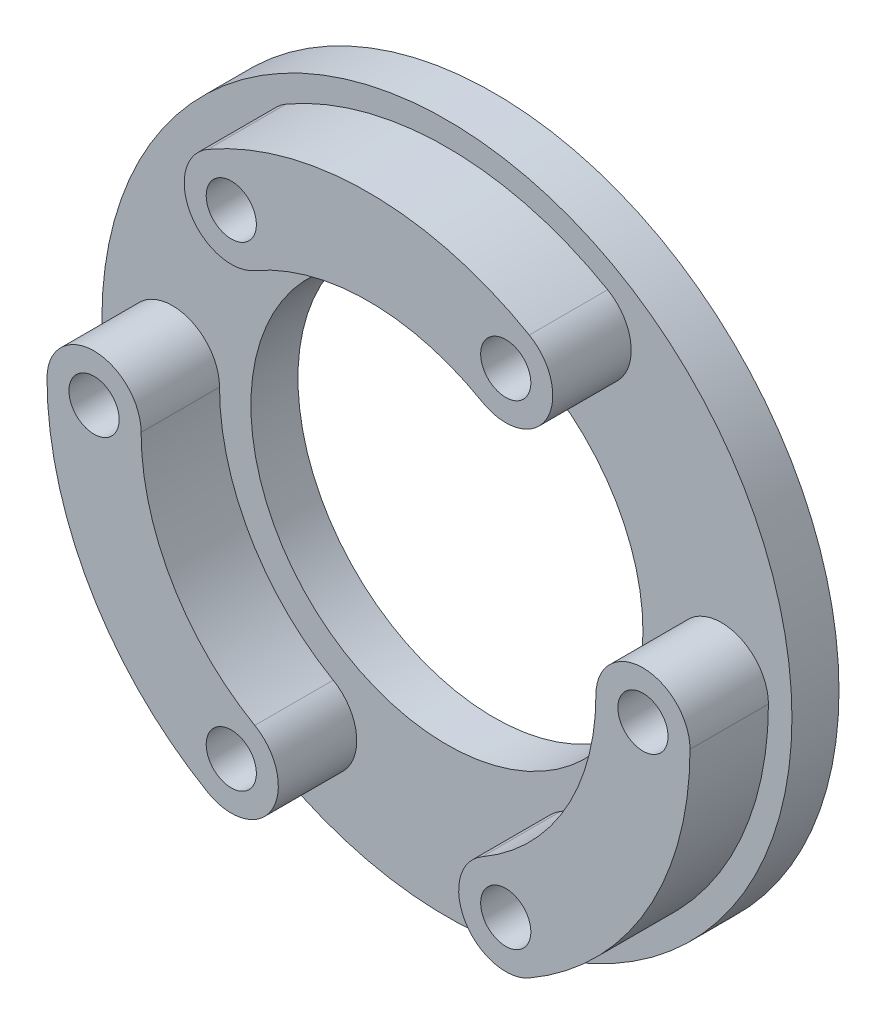
ISO-10303-21;
HEADER;
FILE_DESCRIPTION(('STEP AP214'),'2;1');
FILE_NAME('part.step','',(''),(''),'','','');
FILE_SCHEMA(('AUTOMOTIVE_DESIGN { 1 0 10303 214 1 1 1 1 }'));
ENDSEC;
DATA;
#1=APPLICATION_CONTEXT('core data for automotive mechanical design processes');
#2=APPLICATION_PROTOCOL_DEFINITION('international standard','automotive_design',2000,#1);
#3=PRODUCT_CONTEXT('',#1,'mechanical');
#4=PRODUCT('Part','Part','',(#3));
#5=PRODUCT_RELATED_PRODUCT_CATEGORY('part','',(#4));
#6=PRODUCT_DEFINITION_FORMATION('','',#4);
#7=PRODUCT_DEFINITION_CONTEXT('part definition',#1,'design');
#8=PRODUCT_DEFINITION('design','',#6,#7);
#9=PRODUCT_DEFINITION_SHAPE('','',#8);
#10=(LENGTH_UNIT() NAMED_UNIT(*) SI_UNIT(.MILLI.,.METRE.));
#11=(NAMED_UNIT(*) PLANE_ANGLE_UNIT() SI_UNIT($,.RADIAN.));
#12=(NAMED_UNIT(*) SI_UNIT($,.STERADIAN.) SOLID_ANGLE_UNIT());
#13=UNCERTAINTY_MEASURE_WITH_UNIT(LENGTH_MEASURE(1.E-05),#10,'distance_accuracy_value','');
#14=(GEOMETRIC_REPRESENTATION_CONTEXT(3) GLOBAL_UNCERTAINTY_ASSIGNED_CONTEXT((#13)) GLOBAL_UNIT_ASSIGNED_CONTEXT((#10,
#11,#12)) REPRESENTATION_CONTEXT('',''));
#15=CARTESIAN_POINT('',(0.,0.,0.));
#16=DIRECTION('',(0.,0.,1.));
#17=DIRECTION('',(1.,0.,0.));
#18=AXIS2_PLACEMENT_3D('',#15,#16,#17);
#19=CARTESIAN_POINT('',(0.,0.,3.));
#20=DIRECTION('',(0.,0.,1.));
#21=DIRECTION('',(1.,0.,0.));
#22=AXIS2_PLACEMENT_3D('',#19,#20,#21);
#23=PLANE('',#22);
#24=CARTESIAN_POINT('',(17.5,0.,3.));
#25=DIRECTION('',(0.,0.,1.));
#26=DIRECTION('',(1.,0.,0.));
#27=AXIS2_PLACEMENT_3D('',#24,#25,#26);
#28=CIRCLE('',#27,3.);
#29=CARTESIAN_POINT('',(14.5,0.,3.));
#30=VERTEX_POINT('',#29);
#31=CARTESIAN_POINT('',(20.5,0.,3.));
#32=VERTEX_POINT('',#31);
#33=EDGE_CURVE('E165',#30,#32,#28,.F.);
#34=ORIENTED_EDGE('',*,*,#33,.T.);
#35=CARTESIAN_POINT('',(0.,0.,3.));
#36=DIRECTION('',(0.,0.,1.));
#37=DIRECTION('',(1.,0.,0.));
#38=AXIS2_PLACEMENT_3D('',#35,#36,#37);
#39=CIRCLE('',#38,20.5);
#40=CARTESIAN_POINT('',(10.25,-17.753520777581,3.));
#41=VERTEX_POINT('',#40);
#42=EDGE_CURVE('E155',#32,#41,#39,.F.);
#43=ORIENTED_EDGE('',*,*,#42,.T.);
#44=CARTESIAN_POINT('',(8.74999999999998,-15.1554445662277,3.));
#45=DIRECTION('',(0.,0.,1.));
#46=DIRECTION('',(1.,0.,0.));
#47=AXIS2_PLACEMENT_3D('',#44,#45,#46);
#48=CIRCLE('',#47,3.);
#49=CARTESIAN_POINT('',(7.24999999999998,-12.5573683548744,3.));
#50=VERTEX_POINT('',#49);
#51=EDGE_CURVE('E156',#41,#50,#48,.F.);
#52=ORIENTED_EDGE('',*,*,#51,.T.);
#53=CARTESIAN_POINT('',(0.,0.,3.));
#54=DIRECTION('',(0.,0.,1.));
#55=DIRECTION('',(1.,0.,0.));
#56=AXIS2_PLACEMENT_3D('',#53,#54,#55);
#57=CIRCLE('',#56,14.5);
#58=EDGE_CURVE('E159',#30,#50,#57,.F.);
#59=ORIENTED_EDGE('',*,*,#58,.F.);
#60=EDGE_LOOP('',(#34,#43,#52,#59));
#61=FACE_BOUND('',#60,.T.);
#62=CARTESIAN_POINT('',(-8.75000000000001,15.1554445662277,3.));
#63=DIRECTION('',(0.,0.,1.));
#64=DIRECTION('',(1.,0.,0.));
#65=AXIS2_PLACEMENT_3D('',#62,#63,#64);
#66=CIRCLE('',#65,3.);
#67=CARTESIAN_POINT('',(-7.25000000000001,12.5573683548744,3.));
#68=VERTEX_POINT('',#67);
#69=CARTESIAN_POINT('',(-10.25,17.753520777581,3.));
#70=VERTEX_POINT('',#69);
#71=EDGE_CURVE('E193',#68,#70,#66,.F.);
#72=ORIENTED_EDGE('',*,*,#71,.T.);
#73=CARTESIAN_POINT('',(0.,0.,3.));
#74=DIRECTION('',(0.,0.,1.));
#75=DIRECTION('',(1.,0.,0.));
#76=AXIS2_PLACEMENT_3D('',#73,#74,#75);
#77=CIRCLE('',#76,20.5);
#78=CARTESIAN_POINT('',(10.25,17.753520777581,3.));
#79=VERTEX_POINT('',#78);
#80=EDGE_CURVE('E196',#70,#79,#77,.F.);
#81=ORIENTED_EDGE('',*,*,#80,.T.);
#82=CARTESIAN_POINT('',(8.75000000000003,15.1554445662277,3.));
#83=DIRECTION('',(0.,0.,1.));
#84=DIRECTION('',(1.,0.,0.));
#85=AXIS2_PLACEMENT_3D('',#82,#83,#84);
#86=CIRCLE('',#85,3.);
#87=CARTESIAN_POINT('',(7.25000000000002,12.5573683548743,3.));
#88=VERTEX_POINT('',#87);
#89=EDGE_CURVE('E188',#79,#88,#86,.F.);
#90=ORIENTED_EDGE('',*,*,#89,.T.);
#91=CARTESIAN_POINT('',(0.,0.,3.));
#92=DIRECTION('',(0.,0.,1.));
#93=DIRECTION('',(1.,0.,0.));
#94=AXIS2_PLACEMENT_3D('',#91,#92,#93);
#95=CIRCLE('',#94,14.5);
#96=EDGE_CURVE('E191',#68,#88,#95,.F.);
#97=ORIENTED_EDGE('',*,*,#96,.F.);
#98=EDGE_LOOP('',(#72,#81,#90,#97));
#99=FACE_BOUND('',#98,.T.);
#100=CARTESIAN_POINT('',(-8.75,-15.1554445662277,3.));
#101=DIRECTION('',(0.,0.,1.));
#102=DIRECTION('',(1.,0.,0.));
#103=AXIS2_PLACEMENT_3D('',#100,#101,#102);
#104=CIRCLE('',#103,3.);
#105=CARTESIAN_POINT('',(-7.25,-12.5573683548744,3.));
#106=VERTEX_POINT('',#105);
#107=CARTESIAN_POINT('',(-10.25,-17.753520777581,3.));
#108=VERTEX_POINT('',#107);
#109=EDGE_CURVE('E226',#106,#108,#104,.F.);
#110=ORIENTED_EDGE('',*,*,#109,.T.);
#111=CARTESIAN_POINT('',(0.,0.,3.));
#112=DIRECTION('',(0.,0.,1.));
#113=DIRECTION('',(1.,0.,0.));
#114=AXIS2_PLACEMENT_3D('',#111,#112,#113);
#115=CIRCLE('',#114,20.5);
#116=CARTESIAN_POINT('',(-20.5,0.,3.));
#117=VERTEX_POINT('',#116);
#118=EDGE_CURVE('E229',#108,#117,#115,.F.);
#119=ORIENTED_EDGE('',*,*,#118,.T.);
#120=CARTESIAN_POINT('',(-17.5,0.,3.));
#121=DIRECTION('',(0.,0.,1.));
#122=DIRECTION('',(1.,0.,0.));
#123=AXIS2_PLACEMENT_3D('',#120,#121,#122);
#124=CIRCLE('',#123,3.);
#125=CARTESIAN_POINT('',(-14.5,0.,3.));
#126=VERTEX_POINT('',#125);
#127=EDGE_CURVE('E220',#117,#126,#124,.F.);
#128=ORIENTED_EDGE('',*,*,#127,.T.);
#129=CARTESIAN_POINT('',(0.,0.,3.));
#130=DIRECTION('',(0.,0.,1.));
#131=DIRECTION('',(1.,0.,0.));
#132=AXIS2_PLACEMENT_3D('',#129,#130,#131);
#133=CIRCLE('',#132,14.5);
#134=EDGE_CURVE('E223',#106,#126,#133,.F.);
#135=ORIENTED_EDGE('',*,*,#134,.F.);
#136=EDGE_LOOP('',(#110,#119,#128,#135));
#137=FACE_BOUND('',#136,.T.);
#138=CARTESIAN_POINT('',(0.,0.,3.));
#139=DIRECTION('',(0.,0.,1.));
#140=DIRECTION('',(1.,0.,0.));
#141=AXIS2_PLACEMENT_3D('',#138,#139,#140);
#142=CIRCLE('',#141,22.);
#143=CARTESIAN_POINT('',(22.,0.,3.));
#144=VERTEX_POINT('',#143);
#145=EDGE_CURVE('E12',#144,#144,#142,.T.);
#146=ORIENTED_EDGE('',*,*,#145,.T.);
#147=EDGE_LOOP('',(#146));
#148=FACE_BOUND('',#147,.T.);
#149=CARTESIAN_POINT('',(0.,0.,3.));
#150=DIRECTION('',(0.,0.,1.));
#151=DIRECTION('',(1.,0.,0.));
#152=AXIS2_PLACEMENT_3D('',#149,#150,#151);
#153=CIRCLE('',#152,12.5);
#154=CARTESIAN_POINT('',(12.5,0.,3.));
#155=VERTEX_POINT('',#154);
#156=EDGE_CURVE('E233',#155,#155,#153,.T.);
#157=ORIENTED_EDGE('',*,*,#156,.F.);
#158=EDGE_LOOP('',(#157));
#159=FACE_BOUND('',#158,.T.);
#160=ADVANCED_FACE('F42',(#61,#99,#137,#148,#159),#23,.T.);
#161=CARTESIAN_POINT('',(0.,0.,0.));
#162=DIRECTION('',(0.,0.,1.));
#163=DIRECTION('',(1.,0.,0.));
#164=AXIS2_PLACEMENT_3D('',#161,#162,#163);
#165=PLANE('',#164);
#166=CARTESIAN_POINT('',(8.75000000000003,15.1554445662277,0.));
#167=DIRECTION('',(0.,0.,-1.));
#168=DIRECTION('',(-1.,0.,0.));
#169=AXIS2_PLACEMENT_3D('',#166,#167,#168);
#170=CIRCLE('',#169,1.59999999999999);
#171=CARTESIAN_POINT('',(7.15000000000004,15.1554445662277,0.));
#172=VERTEX_POINT('',#171);
#173=EDGE_CURVE('E487',#172,#172,#170,.T.);
#174=ORIENTED_EDGE('',*,*,#173,.F.);
#175=EDGE_LOOP('',(#174));
#176=FACE_BOUND('',#175,.T.);
#177=CARTESIAN_POINT('',(17.5,0.,0.));
#178=DIRECTION('',(0.,0.,-1.));
#179=DIRECTION('',(-1.,0.,0.));
#180=AXIS2_PLACEMENT_3D('',#177,#178,#179);
#181=CIRCLE('',#180,1.59999999999999);
#182=CARTESIAN_POINT('',(15.9,0.,0.));
#183=VERTEX_POINT('',#182);
#184=EDGE_CURVE('E489',#183,#183,#181,.T.);
#185=ORIENTED_EDGE('',*,*,#184,.F.);
#186=EDGE_LOOP('',(#185));
#187=FACE_BOUND('',#186,.T.);
#188=CARTESIAN_POINT('',(8.74999999999998,-15.1554445662277,0.));
#189=DIRECTION('',(0.,0.,-1.));
#190=DIRECTION('',(-1.,0.,0.));
#191=AXIS2_PLACEMENT_3D('',#188,#189,#190);
#192=CIRCLE('',#191,1.59999999999999);
#193=CARTESIAN_POINT('',(7.14999999999999,-15.1554445662277,0.));
#194=VERTEX_POINT('',#193);
#195=EDGE_CURVE('E497',#194,#194,#192,.T.);
#196=ORIENTED_EDGE('',*,*,#195,.F.);
#197=EDGE_LOOP('',(#196));
#198=FACE_BOUND('',#197,.T.);
#199=CARTESIAN_POINT('',(-8.75,-15.1554445662277,0.));
#200=DIRECTION('',(0.,0.,-1.));
#201=DIRECTION('',(-1.,0.,0.));
#202=AXIS2_PLACEMENT_3D('',#199,#200,#201);
#203=CIRCLE('',#202,1.59999999999999);
#204=CARTESIAN_POINT('',(-10.35,-15.1554445662277,0.));
#205=VERTEX_POINT('',#204);
#206=EDGE_CURVE('E503',#205,#205,#203,.T.);
#207=ORIENTED_EDGE('',*,*,#206,.F.);
#208=EDGE_LOOP('',(#207));
#209=FACE_BOUND('',#208,.T.);
#210=CARTESIAN_POINT('',(-17.5,0.,0.));
#211=DIRECTION('',(0.,0.,-1.));
#212=DIRECTION('',(-1.,0.,0.));
#213=AXIS2_PLACEMENT_3D('',#210,#211,#212);
#214=CIRCLE('',#213,1.59999999999999);
#215=CARTESIAN_POINT('',(-19.1,0.,0.));
#216=VERTEX_POINT('',#215);
#217=EDGE_CURVE('E509',#216,#216,#214,.T.);
#218=ORIENTED_EDGE('',*,*,#217,.F.);
#219=EDGE_LOOP('',(#218));
#220=FACE_BOUND('',#219,.T.);
#221=CARTESIAN_POINT('',(-8.75000000000001,15.1554445662277,0.));
#222=DIRECTION('',(0.,0.,-1.));
#223=DIRECTION('',(-1.,0.,0.));
#224=AXIS2_PLACEMENT_3D('',#221,#222,#223);
#225=CIRCLE('',#224,1.59999999999999);
#226=CARTESIAN_POINT('',(-10.35,15.1554445662277,0.));
#227=VERTEX_POINT('',#226);
#228=EDGE_CURVE('E515',#227,#227,#225,.T.);
#229=ORIENTED_EDGE('',*,*,#228,.F.);
#230=EDGE_LOOP('',(#229));
#231=FACE_BOUND('',#230,.T.);
#232=CARTESIAN_POINT('',(0.,0.,0.));
#233=DIRECTION('',(0.,0.,1.));
#234=DIRECTION('',(1.,0.,0.));
#235=AXIS2_PLACEMENT_3D('',#232,#233,#234);
#236=CIRCLE('',#235,22.);
#237=CARTESIAN_POINT('',(22.,0.,0.));
#238=VERTEX_POINT('',#237);
#239=EDGE_CURVE('E46',#238,#238,#236,.T.);
#240=ORIENTED_EDGE('',*,*,#239,.F.);
#241=EDGE_LOOP('',(#240));
#242=FACE_BOUND('',#241,.T.);
#243=CARTESIAN_POINT('',(0.,0.,0.));
#244=DIRECTION('',(0.,0.,1.));
#245=DIRECTION('',(1.,0.,0.));
#246=AXIS2_PLACEMENT_3D('',#243,#244,#245);
#247=CIRCLE('',#246,12.5);
#248=CARTESIAN_POINT('',(12.5,0.,0.));
#249=VERTEX_POINT('',#248);
#250=EDGE_CURVE('E232',#249,#249,#247,.T.);
#251=ORIENTED_EDGE('',*,*,#250,.T.);
#252=EDGE_LOOP('',(#251));
#253=FACE_BOUND('',#252,.T.);
#254=ADVANCED_FACE('F239',(#176,#187,#198,#209,#220,#231,#242,#253),#165,.F.);
#255=CARTESIAN_POINT('',(0.,0.,3.));
#256=DIRECTION('',(0.,0.,-1.));
#257=DIRECTION('',(-1.,0.,0.));
#258=AXIS2_PLACEMENT_3D('',#255,#256,#257);
#259=CYLINDRICAL_SURFACE('',#258,22.);
#260=ORIENTED_EDGE('',*,*,#145,.F.);
#261=EDGE_LOOP('',(#260));
#262=FACE_BOUND('',#261,.T.);
#263=ORIENTED_EDGE('',*,*,#239,.T.);
#264=EDGE_LOOP('',(#263));
#265=FACE_BOUND('',#264,.T.);
#266=ADVANCED_FACE('F44',(#262,#265),#259,.T.);
#267=CARTESIAN_POINT('',(0.,0.,3.));
#268=DIRECTION('',(0.,0.,-1.));
#269=DIRECTION('',(-1.,0.,0.));
#270=AXIS2_PLACEMENT_3D('',#267,#268,#269);
#271=CYLINDRICAL_SURFACE('',#270,12.5);
#272=ORIENTED_EDGE('',*,*,#156,.T.);
#273=EDGE_LOOP('',(#272));
#274=FACE_BOUND('',#273,.T.);
#275=ORIENTED_EDGE('',*,*,#250,.F.);
#276=EDGE_LOOP('',(#275));
#277=FACE_BOUND('',#276,.T.);
#278=ADVANCED_FACE('F241',(#274,#277),#271,.F.);
#279=CARTESIAN_POINT('',(0.,0.,8.));
#280=DIRECTION('',(0.,0.,-1.));
#281=DIRECTION('',(-1.,0.,0.));
#282=AXIS2_PLACEMENT_3D('',#279,#280,#281);
#283=CYLINDRICAL_SURFACE('',#282,20.5);
#284=ORIENTED_EDGE('',*,*,#118,.F.);
#285=DIRECTION('',(0.,0.,-1.));
#286=VECTOR('',#285,1.);
#287=CARTESIAN_POINT('',(-10.25,-17.753520777581,8.));
#288=LINE('',#287,#286);
#289=CARTESIAN_POINT('',(-10.25,-17.753520777581,8.));
#290=VERTEX_POINT('',#289);
#291=EDGE_CURVE('E217',#290,#108,#288,.T.);
#292=ORIENTED_EDGE('',*,*,#291,.F.);
#293=CARTESIAN_POINT('',(0.,0.,8.));
#294=DIRECTION('',(0.,0.,1.));
#295=DIRECTION('',(1.,0.,0.));
#296=AXIS2_PLACEMENT_3D('',#293,#294,#295);
#297=CIRCLE('',#296,20.5);
#298=CARTESIAN_POINT('',(-20.5,0.,8.));
#299=VERTEX_POINT('',#298);
#300=EDGE_CURVE('E199',#299,#290,#297,.T.);
#301=ORIENTED_EDGE('',*,*,#300,.F.);
#302=DIRECTION('',(0.,0.,-1.));
#303=VECTOR('',#302,1.);
#304=CARTESIAN_POINT('',(-20.5,0.,8.));
#305=LINE('',#304,#303);
#306=EDGE_CURVE('E209',#299,#117,#305,.T.);
#307=ORIENTED_EDGE('',*,*,#306,.T.);
#308=EDGE_LOOP('',(#284,#292,#301,#307));
#309=FACE_BOUND('',#308,.T.);
#310=ADVANCED_FACE('F243',(#309),#283,.T.);
#311=CARTESIAN_POINT('',(-8.75,-15.1554445662277,8.));
#312=DIRECTION('',(0.,0.,-1.));
#313=DIRECTION('',(-1.,0.,0.));
#314=AXIS2_PLACEMENT_3D('',#311,#312,#313);
#315=CYLINDRICAL_SURFACE('',#314,3.);
#316=ORIENTED_EDGE('',*,*,#109,.F.);
#317=DIRECTION('',(0.,0.,-1.));
#318=VECTOR('',#317,1.);
#319=CARTESIAN_POINT('',(-7.25,-12.5573683548744,8.));
#320=LINE('',#319,#318);
#321=CARTESIAN_POINT('',(-7.25,-12.5573683548744,8.));
#322=VERTEX_POINT('',#321);
#323=EDGE_CURVE('E214',#322,#106,#320,.T.);
#324=ORIENTED_EDGE('',*,*,#323,.F.);
#325=CARTESIAN_POINT('',(-8.75,-15.1554445662277,8.));
#326=DIRECTION('',(0.,0.,1.));
#327=DIRECTION('',(1.,0.,0.));
#328=AXIS2_PLACEMENT_3D('',#325,#326,#327);
#329=CIRCLE('',#328,3.);
#330=EDGE_CURVE('E202',#290,#322,#329,.T.);
#331=ORIENTED_EDGE('',*,*,#330,.F.);
#332=ORIENTED_EDGE('',*,*,#291,.T.);
#333=EDGE_LOOP('',(#316,#324,#331,#332));
#334=FACE_BOUND('',#333,.T.);
#335=ADVANCED_FACE('F250',(#334),#315,.T.);
#336=CARTESIAN_POINT('',(0.,0.,8.));
#337=DIRECTION('',(0.,0.,-1.));
#338=DIRECTION('',(-1.,0.,0.));
#339=AXIS2_PLACEMENT_3D('',#336,#337,#338);
#340=CYLINDRICAL_SURFACE('',#339,14.5);
#341=ORIENTED_EDGE('',*,*,#323,.T.);
#342=ORIENTED_EDGE('',*,*,#134,.T.);
#343=DIRECTION('',(0.,0.,-1.));
#344=VECTOR('',#343,1.);
#345=CARTESIAN_POINT('',(-14.5,0.,8.));
#346=LINE('',#345,#344);
#347=CARTESIAN_POINT('',(-14.5,0.,8.));
#348=VERTEX_POINT('',#347);
#349=EDGE_CURVE('E212',#348,#126,#346,.T.);
#350=ORIENTED_EDGE('',*,*,#349,.F.);
#351=CARTESIAN_POINT('',(0.,0.,8.));
#352=DIRECTION('',(0.,0.,1.));
#353=DIRECTION('',(1.,0.,0.));
#354=AXIS2_PLACEMENT_3D('',#351,#352,#353);
#355=CIRCLE('',#354,14.5);
#356=EDGE_CURVE('E204',#348,#322,#355,.T.);
#357=ORIENTED_EDGE('',*,*,#356,.T.);
#358=EDGE_LOOP('',(#341,#342,#350,#357));
#359=FACE_BOUND('',#358,.T.);
#360=ADVANCED_FACE('F278',(#359),#340,.F.);
#361=CARTESIAN_POINT('',(-17.5,0.,8.));
#362=DIRECTION('',(0.,0.,-1.));
#363=DIRECTION('',(-1.,0.,0.));
#364=AXIS2_PLACEMENT_3D('',#361,#362,#363);
#365=CYLINDRICAL_SURFACE('',#364,3.);
#366=ORIENTED_EDGE('',*,*,#127,.F.);
#367=ORIENTED_EDGE('',*,*,#306,.F.);
#368=CARTESIAN_POINT('',(-17.5,0.,8.));
#369=DIRECTION('',(0.,0.,1.));
#370=DIRECTION('',(1.,0.,0.));
#371=AXIS2_PLACEMENT_3D('',#368,#369,#370);
#372=CIRCLE('',#371,3.);
#373=EDGE_CURVE('E207',#348,#299,#372,.T.);
#374=ORIENTED_EDGE('',*,*,#373,.F.);
#375=ORIENTED_EDGE('',*,*,#349,.T.);
#376=EDGE_LOOP('',(#366,#367,#374,#375));
#377=FACE_BOUND('',#376,.T.);
#378=ADVANCED_FACE('F286',(#377),#365,.T.);
#379=CARTESIAN_POINT('',(0.,0.,8.));
#380=DIRECTION('',(0.,0.,1.));
#381=DIRECTION('',(1.,0.,0.));
#382=AXIS2_PLACEMENT_3D('',#379,#380,#381);
#383=PLANE('',#382);
#384=CARTESIAN_POINT('',(-8.75,-15.1554445662277,8.));
#385=DIRECTION('',(0.,0.,-1.));
#386=DIRECTION('',(-1.,0.,0.));
#387=AXIS2_PLACEMENT_3D('',#384,#385,#386);
#388=CIRCLE('',#387,1.6);
#389=CARTESIAN_POINT('',(-10.35,-15.1554445662277,8.));
#390=VERTEX_POINT('',#389);
#391=EDGE_CURVE('E506',#390,#390,#388,.T.);
#392=ORIENTED_EDGE('',*,*,#391,.T.);
#393=EDGE_LOOP('',(#392));
#394=FACE_BOUND('',#393,.T.);
#395=CARTESIAN_POINT('',(-17.5,0.,8.));
#396=DIRECTION('',(0.,0.,-1.));
#397=DIRECTION('',(-1.,0.,0.));
#398=AXIS2_PLACEMENT_3D('',#395,#396,#397);
#399=CIRCLE('',#398,1.6);
#400=CARTESIAN_POINT('',(-19.1,0.,8.));
#401=VERTEX_POINT('',#400);
#402=EDGE_CURVE('E512',#401,#401,#399,.T.);
#403=ORIENTED_EDGE('',*,*,#402,.T.);
#404=EDGE_LOOP('',(#403));
#405=FACE_BOUND('',#404,.T.);
#406=ORIENTED_EDGE('',*,*,#300,.T.);
#407=ORIENTED_EDGE('',*,*,#330,.T.);
#408=ORIENTED_EDGE('',*,*,#356,.F.);
#409=ORIENTED_EDGE('',*,*,#373,.T.);
#410=EDGE_LOOP('',(#406,#407,#408,#409));
#411=FACE_BOUND('',#410,.T.);
#412=ADVANCED_FACE('F282',(#394,#405,#411),#383,.T.);
#413=CARTESIAN_POINT('',(0.,0.,8.));
#414=DIRECTION('',(0.,0.,-1.));
#415=DIRECTION('',(-1.,0.,0.));
#416=AXIS2_PLACEMENT_3D('',#413,#414,#415);
#417=CYLINDRICAL_SURFACE('',#416,20.5);
#418=ORIENTED_EDGE('',*,*,#80,.F.);
#419=DIRECTION('',(0.,0.,-1.));
#420=VECTOR('',#419,1.);
#421=CARTESIAN_POINT('',(-10.25,17.753520777581,8.));
#422=LINE('',#421,#420);
#423=CARTESIAN_POINT('',(-10.25,17.753520777581,8.));
#424=VERTEX_POINT('',#423);
#425=EDGE_CURVE('E185',#424,#70,#422,.T.);
#426=ORIENTED_EDGE('',*,*,#425,.F.);
#427=CARTESIAN_POINT('',(0.,0.,8.));
#428=DIRECTION('',(0.,0.,1.));
#429=DIRECTION('',(1.,0.,0.));
#430=AXIS2_PLACEMENT_3D('',#427,#428,#429);
#431=CIRCLE('',#430,20.5);
#432=CARTESIAN_POINT('',(10.25,17.753520777581,8.));
#433=VERTEX_POINT('',#432);
#434=EDGE_CURVE('E168',#433,#424,#431,.T.);
#435=ORIENTED_EDGE('',*,*,#434,.F.);
#436=DIRECTION('',(0.,0.,-1.));
#437=VECTOR('',#436,1.);
#438=CARTESIAN_POINT('',(10.25,17.753520777581,8.));
#439=LINE('',#438,#437);
#440=EDGE_CURVE('E178',#433,#79,#439,.T.);
#441=ORIENTED_EDGE('',*,*,#440,.T.);
#442=EDGE_LOOP('',(#418,#426,#435,#441));
#443=FACE_BOUND('',#442,.T.);
#444=ADVANCED_FACE('F293',(#443),#417,.T.);
#445=CARTESIAN_POINT('',(-8.75000000000001,15.1554445662277,8.));
#446=DIRECTION('',(0.,0.,-1.));
#447=DIRECTION('',(-1.,0.,0.));
#448=AXIS2_PLACEMENT_3D('',#445,#446,#447);
#449=CYLINDRICAL_SURFACE('',#448,3.);
#450=ORIENTED_EDGE('',*,*,#71,.F.);
#451=DIRECTION('',(0.,0.,-1.));
#452=VECTOR('',#451,1.);
#453=CARTESIAN_POINT('',(-7.25000000000001,12.5573683548744,8.));
#454=LINE('',#453,#452);
#455=CARTESIAN_POINT('',(-7.25000000000001,12.5573683548744,8.));
#456=VERTEX_POINT('',#455);
#457=EDGE_CURVE('E182',#456,#68,#454,.T.);
#458=ORIENTED_EDGE('',*,*,#457,.F.);
#459=CARTESIAN_POINT('',(-8.75000000000001,15.1554445662277,8.));
#460=DIRECTION('',(0.,0.,1.));
#461=DIRECTION('',(1.,0.,0.));
#462=AXIS2_PLACEMENT_3D('',#459,#460,#461);
#463=CIRCLE('',#462,3.);
#464=EDGE_CURVE('E171',#424,#456,#463,.T.);
#465=ORIENTED_EDGE('',*,*,#464,.F.);
#466=ORIENTED_EDGE('',*,*,#425,.T.);
#467=EDGE_LOOP('',(#450,#458,#465,#466));
#468=FACE_BOUND('',#467,.T.);
#469=ADVANCED_FACE('F322',(#468),#449,.T.);
#470=CARTESIAN_POINT('',(0.,0.,8.));
#471=DIRECTION('',(0.,0.,-1.));
#472=DIRECTION('',(-1.,0.,0.));
#473=AXIS2_PLACEMENT_3D('',#470,#471,#472);
#474=CYLINDRICAL_SURFACE('',#473,14.5);
#475=ORIENTED_EDGE('',*,*,#457,.T.);
#476=ORIENTED_EDGE('',*,*,#96,.T.);
#477=DIRECTION('',(0.,0.,-1.));
#478=VECTOR('',#477,1.);
#479=CARTESIAN_POINT('',(7.25000000000002,12.5573683548744,8.));
#480=LINE('',#479,#478);
#481=CARTESIAN_POINT('',(7.25000000000002,12.5573683548744,8.));
#482=VERTEX_POINT('',#481);
#483=EDGE_CURVE('E65',#482,#88,#480,.T.);
#484=ORIENTED_EDGE('',*,*,#483,.F.);
#485=CARTESIAN_POINT('',(0.,0.,8.));
#486=DIRECTION('',(0.,0.,1.));
#487=DIRECTION('',(1.,0.,0.));
#488=AXIS2_PLACEMENT_3D('',#485,#486,#487);
#489=CIRCLE('',#488,14.5);
#490=EDGE_CURVE('E173',#482,#456,#489,.T.);
#491=ORIENTED_EDGE('',*,*,#490,.T.);
#492=EDGE_LOOP('',(#475,#476,#484,#491));
#493=FACE_BOUND('',#492,.T.);
#494=ADVANCED_FACE('F331',(#493),#474,.F.);
#495=CARTESIAN_POINT('',(8.75000000000003,15.1554445662277,8.));
#496=DIRECTION('',(0.,0.,-1.));
#497=DIRECTION('',(-1.,0.,0.));
#498=AXIS2_PLACEMENT_3D('',#495,#496,#497);
#499=CYLINDRICAL_SURFACE('',#498,3.);
#500=ORIENTED_EDGE('',*,*,#89,.F.);
#501=ORIENTED_EDGE('',*,*,#440,.F.);
#502=CARTESIAN_POINT('',(8.75000000000003,15.1554445662277,8.));
#503=DIRECTION('',(0.,0.,1.));
#504=DIRECTION('',(1.,0.,0.));
#505=AXIS2_PLACEMENT_3D('',#502,#503,#504);
#506=CIRCLE('',#505,3.);
#507=EDGE_CURVE('E176',#482,#433,#506,.T.);
#508=ORIENTED_EDGE('',*,*,#507,.F.);
#509=ORIENTED_EDGE('',*,*,#483,.T.);
#510=EDGE_LOOP('',(#500,#501,#508,#509));
#511=FACE_BOUND('',#510,.T.);
#512=ADVANCED_FACE('F341',(#511),#499,.T.);
#513=CARTESIAN_POINT('',(0.,0.,8.));
#514=DIRECTION('',(0.,0.,1.));
#515=DIRECTION('',(1.,0.,0.));
#516=AXIS2_PLACEMENT_3D('',#513,#514,#515);
#517=PLANE('',#516);
#518=CARTESIAN_POINT('',(8.75000000000003,15.1554445662277,8.));
#519=DIRECTION('',(0.,0.,-1.));
#520=DIRECTION('',(-1.,0.,0.));
#521=AXIS2_PLACEMENT_3D('',#518,#519,#520);
#522=CIRCLE('',#521,1.6);
#523=CARTESIAN_POINT('',(7.15000000000003,15.1554445662277,8.));
#524=VERTEX_POINT('',#523);
#525=EDGE_CURVE('E484',#524,#524,#522,.T.);
#526=ORIENTED_EDGE('',*,*,#525,.T.);
#527=EDGE_LOOP('',(#526));
#528=FACE_BOUND('',#527,.T.);
#529=CARTESIAN_POINT('',(-8.75000000000001,15.1554445662277,8.));
#530=DIRECTION('',(0.,0.,-1.));
#531=DIRECTION('',(-1.,0.,0.));
#532=AXIS2_PLACEMENT_3D('',#529,#530,#531);
#533=CIRCLE('',#532,1.6);
#534=CARTESIAN_POINT('',(-10.35,15.1554445662277,8.));
#535=VERTEX_POINT('',#534);
#536=EDGE_CURVE('E151',#535,#535,#533,.T.);
#537=ORIENTED_EDGE('',*,*,#536,.T.);
#538=EDGE_LOOP('',(#537));
#539=FACE_BOUND('',#538,.T.);
#540=ORIENTED_EDGE('',*,*,#434,.T.);
#541=ORIENTED_EDGE('',*,*,#464,.T.);
#542=ORIENTED_EDGE('',*,*,#490,.F.);
#543=ORIENTED_EDGE('',*,*,#507,.T.);
#544=EDGE_LOOP('',(#540,#541,#542,#543));
#545=FACE_BOUND('',#544,.T.);
#546=ADVANCED_FACE('F351',(#528,#539,#545),#517,.T.);
#547=CARTESIAN_POINT('',(0.,0.,8.));
#548=DIRECTION('',(0.,0.,-1.));
#549=DIRECTION('',(-1.,0.,0.));
#550=AXIS2_PLACEMENT_3D('',#547,#548,#549);
#551=CYLINDRICAL_SURFACE('',#550,20.5);
#552=ORIENTED_EDGE('',*,*,#42,.F.);
#553=DIRECTION('',(0.,0.,-1.));
#554=VECTOR('',#553,1.);
#555=CARTESIAN_POINT('',(20.5,0.,8.));
#556=LINE('',#555,#554);
#557=CARTESIAN_POINT('',(20.5,0.,8.));
#558=VERTEX_POINT('',#557);
#559=EDGE_CURVE('E135',#558,#32,#556,.T.);
#560=ORIENTED_EDGE('',*,*,#559,.F.);
#561=CARTESIAN_POINT('',(0.,0.,8.));
#562=DIRECTION('',(0.,0.,1.));
#563=DIRECTION('',(1.,0.,0.));
#564=AXIS2_PLACEMENT_3D('',#561,#562,#563);
#565=CIRCLE('',#564,20.5);
#566=CARTESIAN_POINT('',(10.25,-17.753520777581,8.));
#567=VERTEX_POINT('',#566);
#568=EDGE_CURVE('E143',#567,#558,#565,.T.);
#569=ORIENTED_EDGE('',*,*,#568,.F.);
#570=DIRECTION('',(0.,0.,-1.));
#571=VECTOR('',#570,1.);
#572=CARTESIAN_POINT('',(10.25,-17.753520777581,8.));
#573=LINE('',#572,#571);
#574=EDGE_CURVE('E522',#567,#41,#573,.T.);
#575=ORIENTED_EDGE('',*,*,#574,.T.);
#576=EDGE_LOOP('',(#552,#560,#569,#575));
#577=FACE_BOUND('',#576,.T.);
#578=ADVANCED_FACE('F153',(#577),#551,.T.);
#579=CARTESIAN_POINT('',(17.5,0.,8.));
#580=DIRECTION('',(0.,0.,-1.));
#581=DIRECTION('',(-1.,0.,0.));
#582=AXIS2_PLACEMENT_3D('',#579,#580,#581);
#583=CYLINDRICAL_SURFACE('',#582,3.);
#584=ORIENTED_EDGE('',*,*,#33,.F.);
#585=DIRECTION('',(0.,0.,-1.));
#586=VECTOR('',#585,1.);
#587=CARTESIAN_POINT('',(14.5,0.,8.));
#588=LINE('',#587,#586);
#589=CARTESIAN_POINT('',(14.5,0.,8.));
#590=VERTEX_POINT('',#589);
#591=EDGE_CURVE('E138',#590,#30,#588,.T.);
#592=ORIENTED_EDGE('',*,*,#591,.F.);
#593=CARTESIAN_POINT('',(17.5,0.,8.));
#594=DIRECTION('',(0.,0.,1.));
#595=DIRECTION('',(1.,0.,0.));
#596=AXIS2_PLACEMENT_3D('',#593,#594,#595);
#597=CIRCLE('',#596,3.);
#598=EDGE_CURVE('E131',#558,#590,#597,.T.);
#599=ORIENTED_EDGE('',*,*,#598,.F.);
#600=ORIENTED_EDGE('',*,*,#559,.T.);
#601=EDGE_LOOP('',(#584,#592,#599,#600));
#602=FACE_BOUND('',#601,.T.);
#603=ADVANCED_FACE('F133',(#602),#583,.T.);
#604=CARTESIAN_POINT('',(0.,0.,8.));
#605=DIRECTION('',(0.,0.,-1.));
#606=DIRECTION('',(-1.,0.,0.));
#607=AXIS2_PLACEMENT_3D('',#604,#605,#606);
#608=CYLINDRICAL_SURFACE('',#607,14.5);
#609=ORIENTED_EDGE('',*,*,#591,.T.);
#610=ORIENTED_EDGE('',*,*,#58,.T.);
#611=DIRECTION('',(0.,0.,-1.));
#612=VECTOR('',#611,1.);
#613=CARTESIAN_POINT('',(7.24999999999998,-12.5573683548744,8.));
#614=LINE('',#613,#612);
#615=CARTESIAN_POINT('',(7.24999999999998,-12.5573683548744,8.));
#616=VERTEX_POINT('',#615);
#617=EDGE_CURVE('E57',#616,#50,#614,.T.);
#618=ORIENTED_EDGE('',*,*,#617,.F.);
#619=CARTESIAN_POINT('',(0.,0.,8.));
#620=DIRECTION('',(0.,0.,1.));
#621=DIRECTION('',(1.,0.,0.));
#622=AXIS2_PLACEMENT_3D('',#619,#620,#621);
#623=CIRCLE('',#622,14.5);
#624=EDGE_CURVE('E142',#616,#590,#623,.T.);
#625=ORIENTED_EDGE('',*,*,#624,.T.);
#626=EDGE_LOOP('',(#609,#610,#618,#625));
#627=FACE_BOUND('',#626,.T.);
#628=ADVANCED_FACE('F370',(#627),#608,.F.);
#629=CARTESIAN_POINT('',(8.74999999999998,-15.1554445662277,8.));
#630=DIRECTION('',(0.,0.,-1.));
#631=DIRECTION('',(-1.,0.,0.));
#632=AXIS2_PLACEMENT_3D('',#629,#630,#631);
#633=CYLINDRICAL_SURFACE('',#632,3.);
#634=ORIENTED_EDGE('',*,*,#51,.F.);
#635=ORIENTED_EDGE('',*,*,#574,.F.);
#636=CARTESIAN_POINT('',(8.74999999999998,-15.1554445662277,8.));
#637=DIRECTION('',(0.,0.,1.));
#638=DIRECTION('',(1.,0.,0.));
#639=AXIS2_PLACEMENT_3D('',#636,#637,#638);
#640=CIRCLE('',#639,3.);
#641=EDGE_CURVE('E147',#616,#567,#640,.T.);
#642=ORIENTED_EDGE('',*,*,#641,.F.);
#643=ORIENTED_EDGE('',*,*,#617,.T.);
#644=EDGE_LOOP('',(#634,#635,#642,#643));
#645=FACE_BOUND('',#644,.T.);
#646=ADVANCED_FACE('F379',(#645),#633,.T.);
#647=CARTESIAN_POINT('',(0.,0.,8.));
#648=DIRECTION('',(0.,0.,1.));
#649=DIRECTION('',(1.,0.,0.));
#650=AXIS2_PLACEMENT_3D('',#647,#648,#649);
#651=PLANE('',#650);
#652=CARTESIAN_POINT('',(17.5,0.,8.));
#653=DIRECTION('',(0.,0.,-1.));
#654=DIRECTION('',(-1.,0.,0.));
#655=AXIS2_PLACEMENT_3D('',#652,#653,#654);
#656=CIRCLE('',#655,1.6);
#657=CARTESIAN_POINT('',(15.9,0.,8.));
#658=VERTEX_POINT('',#657);
#659=EDGE_CURVE('E494',#658,#658,#656,.T.);
#660=ORIENTED_EDGE('',*,*,#659,.T.);
#661=EDGE_LOOP('',(#660));
#662=FACE_BOUND('',#661,.T.);
#663=CARTESIAN_POINT('',(8.74999999999998,-15.1554445662277,8.));
#664=DIRECTION('',(0.,0.,-1.));
#665=DIRECTION('',(-1.,0.,0.));
#666=AXIS2_PLACEMENT_3D('',#663,#664,#665);
#667=CIRCLE('',#666,1.6);
#668=CARTESIAN_POINT('',(7.14999999999998,-15.1554445662277,8.));
#669=VERTEX_POINT('',#668);
#670=EDGE_CURVE('E500',#669,#669,#667,.T.);
#671=ORIENTED_EDGE('',*,*,#670,.T.);
#672=EDGE_LOOP('',(#671));
#673=FACE_BOUND('',#672,.T.);
#674=ORIENTED_EDGE('',*,*,#568,.T.);
#675=ORIENTED_EDGE('',*,*,#598,.T.);
#676=ORIENTED_EDGE('',*,*,#624,.F.);
#677=ORIENTED_EDGE('',*,*,#641,.T.);
#678=EDGE_LOOP('',(#674,#675,#676,#677));
#679=FACE_BOUND('',#678,.T.);
#680=ADVANCED_FACE('F146',(#662,#673,#679),#651,.T.);
#681=CARTESIAN_POINT('',(-8.75000000000001,15.1554445662277,0.));
#682=DIRECTION('',(0.,0.,-1.));
#683=DIRECTION('',(-1.,0.,0.));
#684=AXIS2_PLACEMENT_3D('',#681,#682,#683);
#685=CYLINDRICAL_SURFACE('',#684,1.59999999999999);
#686=ORIENTED_EDGE('',*,*,#536,.F.);
#687=EDGE_LOOP('',(#686));
#688=FACE_BOUND('',#687,.T.);
#689=ORIENTED_EDGE('',*,*,#228,.T.);
#690=EDGE_LOOP('',(#689));
#691=FACE_BOUND('',#690,.T.);
#692=ADVANCED_FACE('F417',(#688,#691),#685,.F.);
#693=CARTESIAN_POINT('',(-17.5,0.,0.));
#694=DIRECTION('',(0.,0.,-1.));
#695=DIRECTION('',(-1.,0.,0.));
#696=AXIS2_PLACEMENT_3D('',#693,#694,#695);
#697=CYLINDRICAL_SURFACE('',#696,1.59999999999999);
#698=ORIENTED_EDGE('',*,*,#402,.F.);
#699=EDGE_LOOP('',(#698));
#700=FACE_BOUND('',#699,.T.);
#701=ORIENTED_EDGE('',*,*,#217,.T.);
#702=EDGE_LOOP('',(#701));
#703=FACE_BOUND('',#702,.T.);
#704=ADVANCED_FACE('F427',(#700,#703),#697,.F.);
#705=CARTESIAN_POINT('',(-8.75,-15.1554445662277,0.));
#706=DIRECTION('',(0.,0.,-1.));
#707=DIRECTION('',(-1.,0.,0.));
#708=AXIS2_PLACEMENT_3D('',#705,#706,#707);
#709=CYLINDRICAL_SURFACE('',#708,1.59999999999999);
#710=ORIENTED_EDGE('',*,*,#391,.F.);
#711=EDGE_LOOP('',(#710));
#712=FACE_BOUND('',#711,.T.);
#713=ORIENTED_EDGE('',*,*,#206,.T.);
#714=EDGE_LOOP('',(#713));
#715=FACE_BOUND('',#714,.T.);
#716=ADVANCED_FACE('F437',(#712,#715),#709,.F.);
#717=CARTESIAN_POINT('',(8.74999999999998,-15.1554445662277,0.));
#718=DIRECTION('',(0.,0.,-1.));
#719=DIRECTION('',(-1.,0.,0.));
#720=AXIS2_PLACEMENT_3D('',#717,#718,#719);
#721=CYLINDRICAL_SURFACE('',#720,1.59999999999999);
#722=ORIENTED_EDGE('',*,*,#670,.F.);
#723=EDGE_LOOP('',(#722));
#724=FACE_BOUND('',#723,.T.);
#725=ORIENTED_EDGE('',*,*,#195,.T.);
#726=EDGE_LOOP('',(#725));
#727=FACE_BOUND('',#726,.T.);
#728=ADVANCED_FACE('F447',(#724,#727),#721,.F.);
#729=CARTESIAN_POINT('',(17.5,0.,0.));
#730=DIRECTION('',(0.,0.,-1.));
#731=DIRECTION('',(-1.,0.,0.));
#732=AXIS2_PLACEMENT_3D('',#729,#730,#731);
#733=CYLINDRICAL_SURFACE('',#732,1.59999999999999);
#734=ORIENTED_EDGE('',*,*,#659,.F.);
#735=EDGE_LOOP('',(#734));
#736=FACE_BOUND('',#735,.T.);
#737=ORIENTED_EDGE('',*,*,#184,.T.);
#738=EDGE_LOOP('',(#737));
#739=FACE_BOUND('',#738,.T.);
#740=ADVANCED_FACE('F457',(#736,#739),#733,.F.);
#741=CARTESIAN_POINT('',(8.75000000000003,15.1554445662277,0.));
#742=DIRECTION('',(0.,0.,-1.));
#743=DIRECTION('',(-1.,0.,0.));
#744=AXIS2_PLACEMENT_3D('',#741,#742,#743);
#745=CYLINDRICAL_SURFACE('',#744,1.59999999999999);
#746=ORIENTED_EDGE('',*,*,#525,.F.);
#747=EDGE_LOOP('',(#746));
#748=FACE_BOUND('',#747,.T.);
#749=ORIENTED_EDGE('',*,*,#173,.T.);
#750=EDGE_LOOP('',(#749));
#751=FACE_BOUND('',#750,.T.);
#752=ADVANCED_FACE('F467',(#748,#751),#745,.F.);
#753=CLOSED_SHELL('',(#160,#254,#266,#278,#310,#335,#360,#378,#412,#444,#469,#494,#512,#546,
#578,#603,#628,#646,#680,#692,#704,#716,#728,#740,#752));
#754=MANIFOLD_SOLID_BREP('B2',#753);
#755=ADVANCED_BREP_SHAPE_REPRESENTATION('',(#18,#754),#14);
#756=SHAPE_DEFINITION_REPRESENTATION(#9,#755);
ENDSEC;
END-ISO-10303-21;
